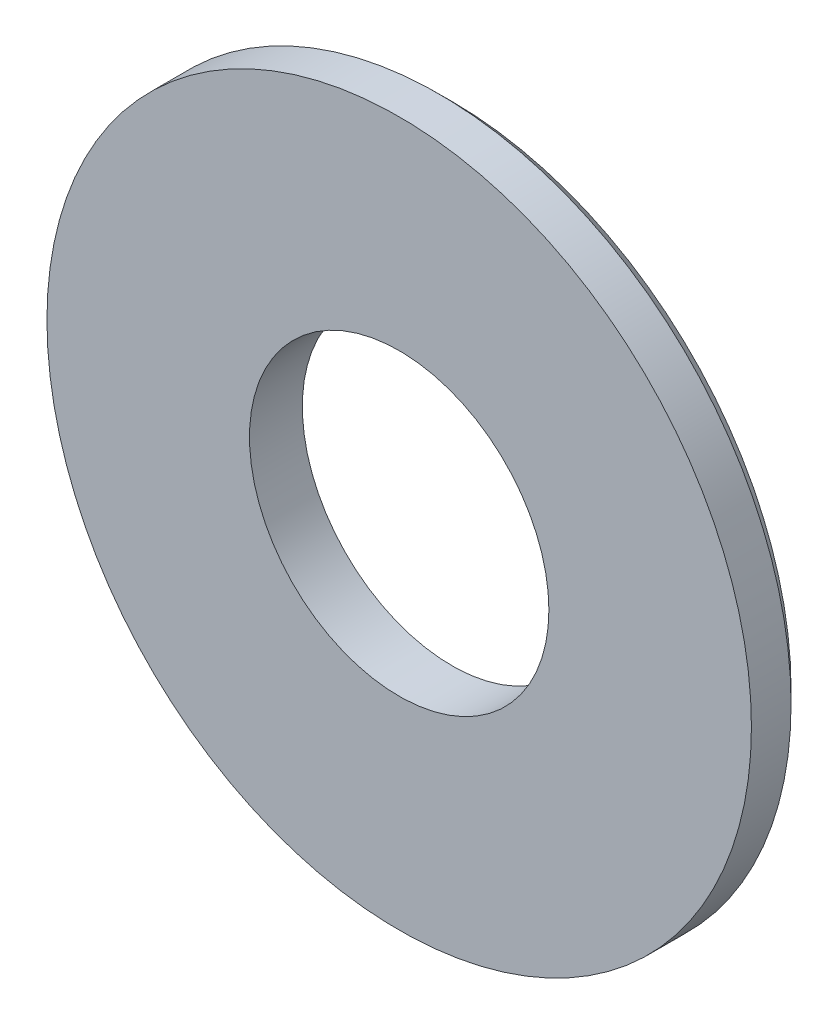
ISO-10303-21;
HEADER;
FILE_DESCRIPTION(('STEP AP214'),'2;1');
FILE_NAME('part.step','',(''),(''),'','','');
FILE_SCHEMA(('AUTOMOTIVE_DESIGN { 1 0 10303 214 1 1 1 1 }'));
ENDSEC;
DATA;
#1=APPLICATION_CONTEXT('core data for automotive mechanical design processes');
#2=APPLICATION_PROTOCOL_DEFINITION('international standard','automotive_design',2000,#1);
#3=PRODUCT_CONTEXT('',#1,'mechanical');
#4=PRODUCT('Part','Part','',(#3));
#5=PRODUCT_RELATED_PRODUCT_CATEGORY('part','',(#4));
#6=PRODUCT_DEFINITION_FORMATION('','',#4);
#7=PRODUCT_DEFINITION_CONTEXT('part definition',#1,'design');
#8=PRODUCT_DEFINITION('design','',#6,#7);
#9=PRODUCT_DEFINITION_SHAPE('','',#8);
#10=(LENGTH_UNIT() NAMED_UNIT(*) SI_UNIT(.MILLI.,.METRE.));
#11=(NAMED_UNIT(*) PLANE_ANGLE_UNIT() SI_UNIT($,.RADIAN.));
#12=(NAMED_UNIT(*) SI_UNIT($,.STERADIAN.) SOLID_ANGLE_UNIT());
#13=UNCERTAINTY_MEASURE_WITH_UNIT(LENGTH_MEASURE(1.E-05),#10,'distance_accuracy_value','');
#14=(GEOMETRIC_REPRESENTATION_CONTEXT(3) GLOBAL_UNCERTAINTY_ASSIGNED_CONTEXT((#13)) GLOBAL_UNIT_ASSIGNED_CONTEXT((#10,
#11,#12)) REPRESENTATION_CONTEXT('',''));
#15=CARTESIAN_POINT('',(0.,0.,0.));
#16=DIRECTION('',(0.,0.,1.));
#17=DIRECTION('',(1.,0.,0.));
#18=AXIS2_PLACEMENT_3D('',#15,#16,#17);
#19=CARTESIAN_POINT('',(0.,0.,0.3));
#20=DIRECTION('',(0.,0.,1.));
#21=DIRECTION('',(1.,0.,0.));
#22=AXIS2_PLACEMENT_3D('',#19,#20,#21);
#23=PLANE('',#22);
#24=CARTESIAN_POINT('',(0.,0.,0.3));
#25=DIRECTION('',(0.,0.,1.));
#26=DIRECTION('',(1.,0.,0.));
#27=AXIS2_PLACEMENT_3D('',#24,#25,#26);
#28=CIRCLE('',#27,2.);
#29=CARTESIAN_POINT('',(2.,0.,0.3));
#30=VERTEX_POINT('',#29);
#31=EDGE_CURVE('E38',#30,#30,#28,.T.);
#32=ORIENTED_EDGE('',*,*,#31,.T.);
#33=EDGE_LOOP('',(#32));
#34=FACE_BOUND('',#33,.T.);
#35=CARTESIAN_POINT('',(0.,0.,0.3));
#36=DIRECTION('',(0.,0.,1.));
#37=DIRECTION('',(1.,0.,0.));
#38=AXIS2_PLACEMENT_3D('',#35,#36,#37);
#39=CIRCLE('',#38,0.85);
#40=CARTESIAN_POINT('',(0.85,0.,0.3));
#41=VERTEX_POINT('',#40);
#42=EDGE_CURVE('E42',#41,#41,#39,.T.);
#43=ORIENTED_EDGE('',*,*,#42,.F.);
#44=EDGE_LOOP('',(#43));
#45=FACE_BOUND('',#44,.T.);
#46=ADVANCED_FACE('F27',(#34,#45),#23,.T.);
#47=CARTESIAN_POINT('',(0.,0.,0.));
#48=DIRECTION('',(0.,0.,1.));
#49=DIRECTION('',(1.,0.,0.));
#50=AXIS2_PLACEMENT_3D('',#47,#48,#49);
#51=PLANE('',#50);
#52=CARTESIAN_POINT('',(0.,0.,0.));
#53=DIRECTION('',(0.,0.,1.));
#54=DIRECTION('',(1.,0.,0.));
#55=AXIS2_PLACEMENT_3D('',#52,#53,#54);
#56=CIRCLE('',#55,1.925);
#57=CARTESIAN_POINT('',(1.925,0.,0.));
#58=VERTEX_POINT('',#57);
#59=EDGE_CURVE('E10',#58,#58,#56,.F.);
#60=ORIENTED_EDGE('',*,*,#59,.T.);
#61=EDGE_LOOP('',(#60));
#62=FACE_BOUND('',#61,.T.);
#63=CARTESIAN_POINT('',(0.,0.,0.));
#64=DIRECTION('',(0.,0.,1.));
#65=DIRECTION('',(1.,0.,0.));
#66=AXIS2_PLACEMENT_3D('',#63,#64,#65);
#67=CIRCLE('',#66,0.85);
#68=CARTESIAN_POINT('',(0.85,0.,0.));
#69=VERTEX_POINT('',#68);
#70=EDGE_CURVE('E47',#69,#69,#67,.T.);
#71=ORIENTED_EDGE('',*,*,#70,.T.);
#72=EDGE_LOOP('',(#71));
#73=FACE_BOUND('',#72,.T.);
#74=ADVANCED_FACE('F51',(#62,#73),#51,.F.);
#75=CARTESIAN_POINT('',(0.,0.,0.3));
#76=DIRECTION('',(0.,0.,-1.));
#77=DIRECTION('',(-1.,0.,0.));
#78=AXIS2_PLACEMENT_3D('',#75,#76,#77);
#79=CYLINDRICAL_SURFACE('',#78,2.);
#80=CARTESIAN_POINT('',(0.,0.,0.075));
#81=DIRECTION('',(0.,0.,1.));
#82=DIRECTION('',(1.,0.,0.));
#83=AXIS2_PLACEMENT_3D('',#80,#81,#82);
#84=CIRCLE('',#83,2.);
#85=CARTESIAN_POINT('',(2.,0.,0.075));
#86=VERTEX_POINT('',#85);
#87=EDGE_CURVE('E34',#86,#86,#84,.T.);
#88=ORIENTED_EDGE('',*,*,#87,.T.);
#89=EDGE_LOOP('',(#88));
#90=FACE_BOUND('',#89,.T.);
#91=ORIENTED_EDGE('',*,*,#31,.F.);
#92=EDGE_LOOP('',(#91));
#93=FACE_BOUND('',#92,.T.);
#94=ADVANCED_FACE('F29',(#90,#93),#79,.T.);
#95=CARTESIAN_POINT('',(0.,0.,0.3));
#96=DIRECTION('',(0.,0.,-1.));
#97=DIRECTION('',(-1.,0.,0.));
#98=AXIS2_PLACEMENT_3D('',#95,#96,#97);
#99=CYLINDRICAL_SURFACE('',#98,0.85);
#100=ORIENTED_EDGE('',*,*,#42,.T.);
#101=EDGE_LOOP('',(#100));
#102=FACE_BOUND('',#101,.T.);
#103=ORIENTED_EDGE('',*,*,#70,.F.);
#104=EDGE_LOOP('',(#103));
#105=FACE_BOUND('',#104,.T.);
#106=ADVANCED_FACE('F53',(#102,#105),#99,.F.);
#107=CARTESIAN_POINT('',(0.,0.,0.075));
#108=DIRECTION('',(0.,0.,1.));
#109=DIRECTION('',(1.,0.,0.));
#110=AXIS2_PLACEMENT_3D('',#107,#108,#109);
#111=CONICAL_SURFACE('',#110,2.,0.785398163397448);
#112=ORIENTED_EDGE('',*,*,#59,.F.);
#113=EDGE_LOOP('',(#112));
#114=FACE_BOUND('',#113,.T.);
#115=ORIENTED_EDGE('',*,*,#87,.F.);
#116=EDGE_LOOP('',(#115));
#117=FACE_BOUND('',#116,.T.);
#118=ADVANCED_FACE('F55',(#114,#117),#111,.T.);
#119=CLOSED_SHELL('',(#46,#74,#94,#106,#118));
#120=MANIFOLD_SOLID_BREP('B2',#119);
#121=ADVANCED_BREP_SHAPE_REPRESENTATION('',(#18,#120),#14);
#122=SHAPE_DEFINITION_REPRESENTATION(#9,#121);
ENDSEC;
END-ISO-10303-21;
